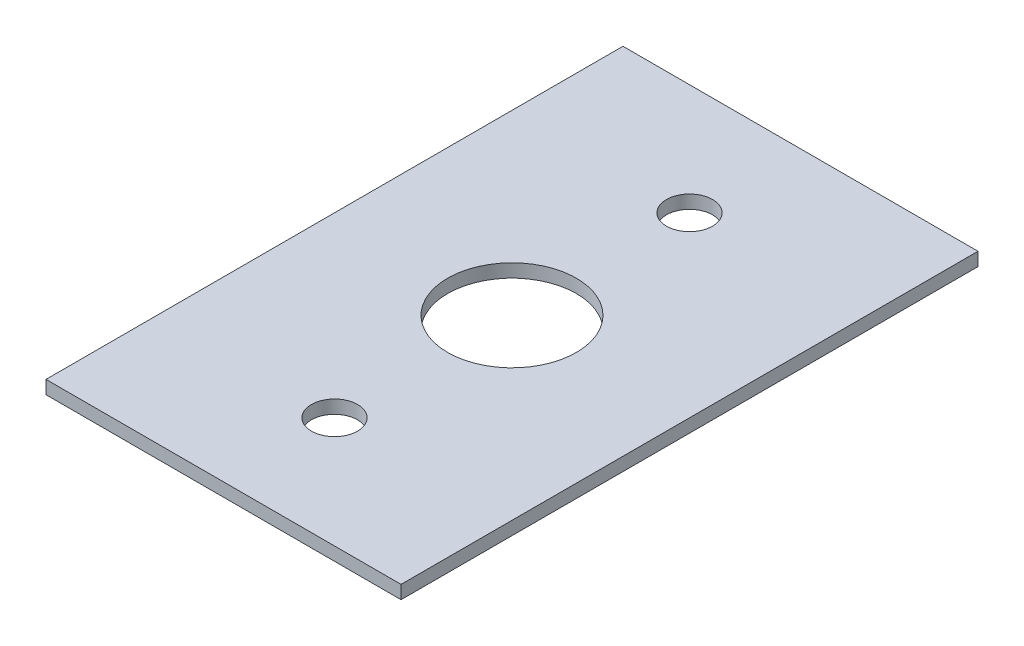
ISO-10303-21;
HEADER;
FILE_DESCRIPTION(('STEP AP214'),'2;1');
FILE_NAME('part.step','',(''),(''),'','','');
FILE_SCHEMA(('AUTOMOTIVE_DESIGN { 1 0 10303 214 1 1 1 1 }'));
ENDSEC;
DATA;
#1=APPLICATION_CONTEXT('core data for automotive mechanical design processes');
#2=APPLICATION_PROTOCOL_DEFINITION('international standard','automotive_design',2000,#1);
#3=PRODUCT_CONTEXT('',#1,'mechanical');
#4=PRODUCT('Part','Part','',(#3));
#5=PRODUCT_RELATED_PRODUCT_CATEGORY('part','',(#4));
#6=PRODUCT_DEFINITION_FORMATION('','',#4);
#7=PRODUCT_DEFINITION_CONTEXT('part definition',#1,'design');
#8=PRODUCT_DEFINITION('design','',#6,#7);
#9=PRODUCT_DEFINITION_SHAPE('','',#8);
#10=(LENGTH_UNIT() NAMED_UNIT(*) SI_UNIT(.MILLI.,.METRE.));
#11=(NAMED_UNIT(*) PLANE_ANGLE_UNIT() SI_UNIT($,.RADIAN.));
#12=(NAMED_UNIT(*) SI_UNIT($,.STERADIAN.) SOLID_ANGLE_UNIT());
#13=UNCERTAINTY_MEASURE_WITH_UNIT(LENGTH_MEASURE(1.E-05),#10,'distance_accuracy_value','');
#14=(GEOMETRIC_REPRESENTATION_CONTEXT(3) GLOBAL_UNCERTAINTY_ASSIGNED_CONTEXT((#13)) GLOBAL_UNIT_ASSIGNED_CONTEXT((#10,
#11,#12)) REPRESENTATION_CONTEXT('',''));
#15=CARTESIAN_POINT('',(0.,0.,0.));
#16=DIRECTION('',(0.,0.,1.));
#17=DIRECTION('',(1.,0.,0.));
#18=AXIS2_PLACEMENT_3D('',#15,#16,#17);
#19=CARTESIAN_POINT('',(-20.,-1.5,-32.5));
#20=DIRECTION('',(-1.,0.,0.));
#21=DIRECTION('',(0.,0.,1.));
#22=AXIS2_PLACEMENT_3D('',#19,#20,#21);
#23=PLANE('',#22);
#24=DIRECTION('',(0.,0.,1.));
#25=VECTOR('',#24,1.);
#26=CARTESIAN_POINT('',(-20.,0.,-32.5));
#27=LINE('',#26,#25);
#28=CARTESIAN_POINT('',(-20.,0.,-32.5));
#29=VERTEX_POINT('',#28);
#30=CARTESIAN_POINT('',(-20.,0.,32.5));
#31=VERTEX_POINT('',#30);
#32=EDGE_CURVE('E112',#29,#31,#27,.T.);
#33=ORIENTED_EDGE('',*,*,#32,.F.);
#34=DIRECTION('',(0.,1.,0.));
#35=VECTOR('',#34,1.);
#36=CARTESIAN_POINT('',(-20.,-1.5,-32.5));
#37=LINE('',#36,#35);
#38=CARTESIAN_POINT('',(-20.,-1.5,-32.5));
#39=VERTEX_POINT('',#38);
#40=EDGE_CURVE('E11',#39,#29,#37,.T.);
#41=ORIENTED_EDGE('',*,*,#40,.F.);
#42=DIRECTION('',(0.,0.,1.));
#43=VECTOR('',#42,1.);
#44=CARTESIAN_POINT('',(-20.,-1.5,-32.5));
#45=LINE('',#44,#43);
#46=CARTESIAN_POINT('',(-20.,-1.5,32.5));
#47=VERTEX_POINT('',#46);
#48=EDGE_CURVE('E103',#39,#47,#45,.T.);
#49=ORIENTED_EDGE('',*,*,#48,.T.);
#50=DIRECTION('',(0.,1.,0.));
#51=VECTOR('',#50,1.);
#52=CARTESIAN_POINT('',(-20.,-1.5,32.5));
#53=LINE('',#52,#51);
#54=EDGE_CURVE('E44',#47,#31,#53,.T.);
#55=ORIENTED_EDGE('',*,*,#54,.T.);
#56=EDGE_LOOP('',(#33,#41,#49,#55));
#57=FACE_BOUND('',#56,.T.);
#58=ADVANCED_FACE('F41',(#57),#23,.T.);
#59=CARTESIAN_POINT('',(20.,-1.5,-32.5));
#60=DIRECTION('',(0.,0.,-1.));
#61=DIRECTION('',(-1.,0.,0.));
#62=AXIS2_PLACEMENT_3D('',#59,#60,#61);
#63=PLANE('',#62);
#64=DIRECTION('',(-1.,0.,0.));
#65=VECTOR('',#64,1.);
#66=CARTESIAN_POINT('',(20.,0.,-32.5));
#67=LINE('',#66,#65);
#68=CARTESIAN_POINT('',(20.,0.,-32.5));
#69=VERTEX_POINT('',#68);
#70=EDGE_CURVE('E106',#69,#29,#67,.T.);
#71=ORIENTED_EDGE('',*,*,#70,.F.);
#72=DIRECTION('',(0.,1.,0.));
#73=VECTOR('',#72,1.);
#74=CARTESIAN_POINT('',(20.,-1.5,-32.5));
#75=LINE('',#74,#73);
#76=CARTESIAN_POINT('',(20.,-1.5,-32.5));
#77=VERTEX_POINT('',#76);
#78=EDGE_CURVE('E51',#77,#69,#75,.T.);
#79=ORIENTED_EDGE('',*,*,#78,.F.);
#80=DIRECTION('',(-1.,0.,0.));
#81=VECTOR('',#80,1.);
#82=CARTESIAN_POINT('',(20.,-1.5,-32.5));
#83=LINE('',#82,#81);
#84=EDGE_CURVE('E98',#77,#39,#83,.T.);
#85=ORIENTED_EDGE('',*,*,#84,.T.);
#86=ORIENTED_EDGE('',*,*,#40,.T.);
#87=EDGE_LOOP('',(#71,#79,#85,#86));
#88=FACE_BOUND('',#87,.T.);
#89=ADVANCED_FACE('F129',(#88),#63,.T.);
#90=CARTESIAN_POINT('',(20.,-1.5,-32.5));
#91=DIRECTION('',(1.,0.,0.));
#92=DIRECTION('',(0.,0.,-1.));
#93=AXIS2_PLACEMENT_3D('',#90,#91,#92);
#94=PLANE('',#93);
#95=DIRECTION('',(0.,0.,-1.));
#96=VECTOR('',#95,1.);
#97=CARTESIAN_POINT('',(20.,0.,-32.5));
#98=LINE('',#97,#96);
#99=CARTESIAN_POINT('',(20.,0.,32.5));
#100=VERTEX_POINT('',#99);
#101=EDGE_CURVE('E92',#100,#69,#98,.T.);
#102=ORIENTED_EDGE('',*,*,#101,.F.);
#103=DIRECTION('',(0.,1.,0.));
#104=VECTOR('',#103,1.);
#105=CARTESIAN_POINT('',(20.,-1.5,32.5));
#106=LINE('',#105,#104);
#107=CARTESIAN_POINT('',(20.,-1.5,32.5));
#108=VERTEX_POINT('',#107);
#109=EDGE_CURVE('E87',#108,#100,#106,.T.);
#110=ORIENTED_EDGE('',*,*,#109,.F.);
#111=DIRECTION('',(0.,0.,-1.));
#112=VECTOR('',#111,1.);
#113=CARTESIAN_POINT('',(20.,-1.5,-32.5));
#114=LINE('',#113,#112);
#115=EDGE_CURVE('E90',#108,#77,#114,.T.);
#116=ORIENTED_EDGE('',*,*,#115,.T.);
#117=ORIENTED_EDGE('',*,*,#78,.T.);
#118=EDGE_LOOP('',(#102,#110,#116,#117));
#119=FACE_BOUND('',#118,.T.);
#120=ADVANCED_FACE('F89',(#119),#94,.T.);
#121=CARTESIAN_POINT('',(20.,-1.5,32.5));
#122=DIRECTION('',(0.,0.,1.));
#123=DIRECTION('',(1.,0.,0.));
#124=AXIS2_PLACEMENT_3D('',#121,#122,#123);
#125=PLANE('',#124);
#126=DIRECTION('',(1.,0.,0.));
#127=VECTOR('',#126,1.);
#128=CARTESIAN_POINT('',(20.,0.,32.5));
#129=LINE('',#128,#127);
#130=EDGE_CURVE('E116',#31,#100,#129,.T.);
#131=ORIENTED_EDGE('',*,*,#130,.F.);
#132=ORIENTED_EDGE('',*,*,#54,.F.);
#133=DIRECTION('',(1.,0.,0.));
#134=VECTOR('',#133,1.);
#135=CARTESIAN_POINT('',(20.,-1.5,32.5));
#136=LINE('',#135,#134);
#137=EDGE_CURVE('E97',#47,#108,#136,.T.);
#138=ORIENTED_EDGE('',*,*,#137,.T.);
#139=ORIENTED_EDGE('',*,*,#109,.T.);
#140=EDGE_LOOP('',(#131,#132,#138,#139));
#141=FACE_BOUND('',#140,.T.);
#142=ADVANCED_FACE('F101',(#141),#125,.T.);
#143=CARTESIAN_POINT('',(0.,-1.5,0.));
#144=DIRECTION('',(0.,-1.,0.));
#145=DIRECTION('',(0.,0.,-1.));
#146=AXIS2_PLACEMENT_3D('',#143,#144,#145);
#147=PLANE('',#146);
#148=CARTESIAN_POINT('',(0.,-1.5,0.));
#149=DIRECTION('',(0.,-1.,0.));
#150=DIRECTION('',(0.,0.,-1.));
#151=AXIS2_PLACEMENT_3D('',#148,#149,#150);
#152=CIRCLE('',#151,7.25);
#153=CARTESIAN_POINT('',(0.,-1.5,-7.25));
#154=VERTEX_POINT('',#153);
#155=EDGE_CURVE('E166',#154,#154,#152,.F.);
#156=ORIENTED_EDGE('',*,*,#155,.T.);
#157=EDGE_LOOP('',(#156));
#158=FACE_BOUND('',#157,.T.);
#159=CARTESIAN_POINT('',(0.,-1.5,-20.));
#160=DIRECTION('',(0.,-1.,0.));
#161=DIRECTION('',(0.,0.,-1.));
#162=AXIS2_PLACEMENT_3D('',#159,#160,#161);
#163=CIRCLE('',#162,2.6);
#164=CARTESIAN_POINT('',(0.,-1.5,-22.6));
#165=VERTEX_POINT('',#164);
#166=EDGE_CURVE('E182',#165,#165,#163,.F.);
#167=ORIENTED_EDGE('',*,*,#166,.T.);
#168=EDGE_LOOP('',(#167));
#169=FACE_BOUND('',#168,.T.);
#170=CARTESIAN_POINT('',(0.,-1.5,20.));
#171=DIRECTION('',(0.,-1.,0.));
#172=DIRECTION('',(0.,0.,-1.));
#173=AXIS2_PLACEMENT_3D('',#170,#171,#172);
#174=CIRCLE('',#173,2.6);
#175=CARTESIAN_POINT('',(0.,-1.5,17.4));
#176=VERTEX_POINT('',#175);
#177=EDGE_CURVE('E171',#176,#176,#174,.F.);
#178=ORIENTED_EDGE('',*,*,#177,.T.);
#179=EDGE_LOOP('',(#178));
#180=FACE_BOUND('',#179,.T.);
#181=ORIENTED_EDGE('',*,*,#48,.F.);
#182=ORIENTED_EDGE('',*,*,#84,.F.);
#183=ORIENTED_EDGE('',*,*,#115,.F.);
#184=ORIENTED_EDGE('',*,*,#137,.F.);
#185=EDGE_LOOP('',(#181,#182,#183,#184));
#186=FACE_BOUND('',#185,.T.);
#187=ADVANCED_FACE('F96',(#158,#169,#180,#186),#147,.T.);
#188=CARTESIAN_POINT('',(0.,0.,0.));
#189=DIRECTION('',(0.,-1.,0.));
#190=DIRECTION('',(0.,0.,-1.));
#191=AXIS2_PLACEMENT_3D('',#188,#189,#190);
#192=PLANE('',#191);
#193=CARTESIAN_POINT('',(0.,0.,0.));
#194=DIRECTION('',(0.,1.,0.));
#195=DIRECTION('',(0.,0.,1.));
#196=AXIS2_PLACEMENT_3D('',#193,#194,#195);
#197=CIRCLE('',#196,7.25);
#198=CARTESIAN_POINT('',(0.,0.,7.25));
#199=VERTEX_POINT('',#198);
#200=EDGE_CURVE('E169',#199,#199,#197,.T.);
#201=ORIENTED_EDGE('',*,*,#200,.F.);
#202=EDGE_LOOP('',(#201));
#203=FACE_BOUND('',#202,.T.);
#204=CARTESIAN_POINT('',(0.,0.,-20.));
#205=DIRECTION('',(0.,1.,0.));
#206=DIRECTION('',(0.,0.,1.));
#207=AXIS2_PLACEMENT_3D('',#204,#205,#206);
#208=CIRCLE('',#207,2.6);
#209=CARTESIAN_POINT('',(0.,0.,-17.4));
#210=VERTEX_POINT('',#209);
#211=EDGE_CURVE('E117',#210,#210,#208,.T.);
#212=ORIENTED_EDGE('',*,*,#211,.F.);
#213=EDGE_LOOP('',(#212));
#214=FACE_BOUND('',#213,.T.);
#215=CARTESIAN_POINT('',(0.,0.,20.));
#216=DIRECTION('',(0.,1.,0.));
#217=DIRECTION('',(0.,0.,-1.));
#218=AXIS2_PLACEMENT_3D('',#215,#216,#217);
#219=CIRCLE('',#218,2.6);
#220=CARTESIAN_POINT('',(0.,0.,17.4));
#221=VERTEX_POINT('',#220);
#222=EDGE_CURVE('E176',#221,#221,#219,.T.);
#223=ORIENTED_EDGE('',*,*,#222,.F.);
#224=EDGE_LOOP('',(#223));
#225=FACE_BOUND('',#224,.T.);
#226=ORIENTED_EDGE('',*,*,#32,.T.);
#227=ORIENTED_EDGE('',*,*,#130,.T.);
#228=ORIENTED_EDGE('',*,*,#101,.T.);
#229=ORIENTED_EDGE('',*,*,#70,.T.);
#230=EDGE_LOOP('',(#226,#227,#228,#229));
#231=FACE_BOUND('',#230,.T.);
#232=ADVANCED_FACE('F128',(#203,#214,#225,#231),#192,.F.);
#233=CARTESIAN_POINT('',(0.,-1.501,20.));
#234=DIRECTION('',(0.,1.,0.));
#235=DIRECTION('',(0.,0.,1.));
#236=AXIS2_PLACEMENT_3D('',#233,#234,#235);
#237=CYLINDRICAL_SURFACE('',#236,2.6);
#238=ORIENTED_EDGE('',*,*,#177,.F.);
#239=EDGE_LOOP('',(#238));
#240=FACE_BOUND('',#239,.T.);
#241=ORIENTED_EDGE('',*,*,#222,.T.);
#242=EDGE_LOOP('',(#241));
#243=FACE_BOUND('',#242,.T.);
#244=ADVANCED_FACE('F147',(#240,#243),#237,.F.);
#245=CARTESIAN_POINT('',(0.,-1.501,-20.));
#246=DIRECTION('',(0.,1.,0.));
#247=DIRECTION('',(0.,0.,1.));
#248=AXIS2_PLACEMENT_3D('',#245,#246,#247);
#249=CYLINDRICAL_SURFACE('',#248,2.6);
#250=ORIENTED_EDGE('',*,*,#166,.F.);
#251=EDGE_LOOP('',(#250));
#252=FACE_BOUND('',#251,.T.);
#253=ORIENTED_EDGE('',*,*,#211,.T.);
#254=EDGE_LOOP('',(#253));
#255=FACE_BOUND('',#254,.T.);
#256=ADVANCED_FACE('F154',(#252,#255),#249,.F.);
#257=CARTESIAN_POINT('',(0.,-1.501,0.));
#258=DIRECTION('',(0.,1.,0.));
#259=DIRECTION('',(0.,0.,1.));
#260=AXIS2_PLACEMENT_3D('',#257,#258,#259);
#261=CYLINDRICAL_SURFACE('',#260,7.25);
#262=ORIENTED_EDGE('',*,*,#155,.F.);
#263=EDGE_LOOP('',(#262));
#264=FACE_BOUND('',#263,.T.);
#265=ORIENTED_EDGE('',*,*,#200,.T.);
#266=EDGE_LOOP('',(#265));
#267=FACE_BOUND('',#266,.T.);
#268=ADVANCED_FACE('F158',(#264,#267),#261,.F.);
#269=CLOSED_SHELL('',(#58,#89,#120,#142,#187,#232,#244,#256,#268));
#270=MANIFOLD_SOLID_BREP('B2',#269);
#271=ADVANCED_BREP_SHAPE_REPRESENTATION('',(#18,#270),#14);
#272=SHAPE_DEFINITION_REPRESENTATION(#9,#271);
ENDSEC;
END-ISO-10303-21;
